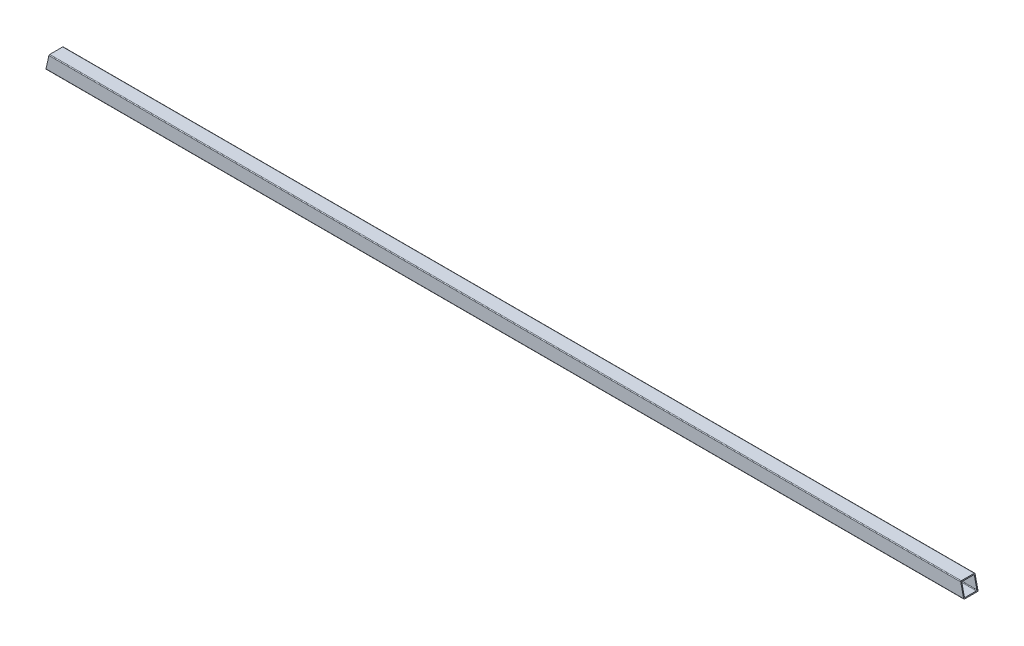
ISO-10303-21;
HEADER;
FILE_DESCRIPTION(('STEP AP214'),'2;1');
FILE_NAME('part.step','',(''),(''),'','','');
FILE_SCHEMA(('AUTOMOTIVE_DESIGN { 1 0 10303 214 1 1 1 1 }'));
ENDSEC;
DATA;
#1=APPLICATION_CONTEXT('core data for automotive mechanical design processes');
#2=APPLICATION_PROTOCOL_DEFINITION('international standard','automotive_design',2000,#1);
#3=PRODUCT_CONTEXT('',#1,'mechanical');
#4=PRODUCT('Part','Part','',(#3));
#5=PRODUCT_RELATED_PRODUCT_CATEGORY('part','',(#4));
#6=PRODUCT_DEFINITION_FORMATION('','',#4);
#7=PRODUCT_DEFINITION_CONTEXT('part definition',#1,'design');
#8=PRODUCT_DEFINITION('design','',#6,#7);
#9=PRODUCT_DEFINITION_SHAPE('','',#8);
#10=(LENGTH_UNIT() NAMED_UNIT(*) SI_UNIT(.MILLI.,.METRE.));
#11=(NAMED_UNIT(*) PLANE_ANGLE_UNIT() SI_UNIT($,.RADIAN.));
#12=(NAMED_UNIT(*) SI_UNIT($,.STERADIAN.) SOLID_ANGLE_UNIT());
#13=UNCERTAINTY_MEASURE_WITH_UNIT(LENGTH_MEASURE(1.E-05),#10,'distance_accuracy_value','');
#14=(GEOMETRIC_REPRESENTATION_CONTEXT(3) GLOBAL_UNCERTAINTY_ASSIGNED_CONTEXT((#13)) GLOBAL_UNIT_ASSIGNED_CONTEXT((#10,
#11,#12)) REPRESENTATION_CONTEXT('',''));
#15=CARTESIAN_POINT('',(0.,0.,0.));
#16=DIRECTION('',(0.,0.,1.));
#17=DIRECTION('',(1.,0.,0.));
#18=AXIS2_PLACEMENT_3D('',#15,#16,#17);
#19=CARTESIAN_POINT('',(812.8,-11.43,-11.43));
#20=DIRECTION('',(-1.,0.,0.));
#21=DIRECTION('',(0.,0.,1.));
#22=AXIS2_PLACEMENT_3D('',#19,#20,#21);
#23=CYLINDRICAL_SURFACE('',#22,1.27);
#24=CARTESIAN_POINT('',(-812.518447778444,-11.43,-11.43));
#25=DIRECTION('',(-0.976296007119935,0.216439613938096,0.));
#26=DIRECTION('',(-0.216439613938096,-0.976296007119935,0.));
#27=AXIS2_PLACEMENT_3D('',#24,#25,#26);
#28=ELLIPSE('',#27,1.30083498317943,1.27);
#29=CARTESIAN_POINT('',(-812.518447778443,-11.4300000000001,-12.7));
#30=VERTEX_POINT('',#29);
#31=CARTESIAN_POINT('',(-812.8,-12.7,-11.43));
#32=VERTEX_POINT('',#31);
#33=EDGE_CURVE('E203',#30,#32,#28,.T.);
#34=ORIENTED_EDGE('',*,*,#33,.F.);
#35=DIRECTION('',(-1.,0.,0.));
#36=VECTOR('',#35,1.);
#37=CARTESIAN_POINT('',(812.8,-11.43,-12.7));
#38=LINE('',#37,#36);
#39=CARTESIAN_POINT('',(812.518447778443,-11.43,-12.7));
#40=VERTEX_POINT('',#39);
#41=EDGE_CURVE('E48',#40,#30,#38,.T.);
#42=ORIENTED_EDGE('',*,*,#41,.F.);
#43=CARTESIAN_POINT('',(812.518447778443,-11.43,-11.43));
#44=DIRECTION('',(-0.976296007119935,-0.216439613938096,0.));
#45=DIRECTION('',(-0.216439613938096,0.976296007119935,0.));
#46=AXIS2_PLACEMENT_3D('',#43,#44,#45);
#47=ELLIPSE('',#46,1.30083498317943,1.27);
#48=CARTESIAN_POINT('',(812.8,-12.7,-11.43));
#49=VERTEX_POINT('',#48);
#50=EDGE_CURVE('E201',#40,#49,#47,.T.);
#51=ORIENTED_EDGE('',*,*,#50,.T.);
#52=DIRECTION('',(-1.,0.,0.));
#53=VECTOR('',#52,1.);
#54=CARTESIAN_POINT('',(812.8,-12.7,-11.43));
#55=LINE('',#54,#53);
#56=EDGE_CURVE('E204',#49,#32,#55,.T.);
#57=ORIENTED_EDGE('',*,*,#56,.T.);
#58=EDGE_LOOP('',(#34,#42,#51,#57));
#59=FACE_BOUND('',#58,.T.);
#60=ADVANCED_FACE('F41',(#59),#23,.T.);
#61=CARTESIAN_POINT('',(812.8,-11.43,-12.7));
#62=DIRECTION('',(0.,0.,1.));
#63=DIRECTION('',(1.,0.,0.));
#64=AXIS2_PLACEMENT_3D('',#61,#62,#63);
#65=PLANE('',#64);
#66=DIRECTION('',(-0.216439613938096,-0.976296007119935,0.));
#67=VECTOR('',#66,1.);
#68=CARTESIAN_POINT('',(-812.8,-12.7,-12.7));
#69=LINE('',#68,#67);
#70=CARTESIAN_POINT('',(-807.450507790426,11.43,-12.7));
#71=VERTEX_POINT('',#70);
#72=EDGE_CURVE('E162',#71,#30,#69,.T.);
#73=ORIENTED_EDGE('',*,*,#72,.F.);
#74=DIRECTION('',(-1.,0.,0.));
#75=VECTOR('',#74,1.);
#76=CARTESIAN_POINT('',(812.8,11.43,-12.7));
#77=LINE('',#76,#75);
#78=CARTESIAN_POINT('',(807.450507790426,11.43,-12.7));
#79=VERTEX_POINT('',#78);
#80=EDGE_CURVE('E187',#79,#71,#77,.T.);
#81=ORIENTED_EDGE('',*,*,#80,.F.);
#82=DIRECTION('',(0.216439613938096,-0.976296007119935,0.));
#83=VECTOR('',#82,1.);
#84=CARTESIAN_POINT('',(812.8,-12.7,-12.7));
#85=LINE('',#84,#83);
#86=EDGE_CURVE('E196',#79,#40,#85,.T.);
#87=ORIENTED_EDGE('',*,*,#86,.T.);
#88=ORIENTED_EDGE('',*,*,#41,.T.);
#89=EDGE_LOOP('',(#73,#81,#87,#88));
#90=FACE_BOUND('',#89,.T.);
#91=ADVANCED_FACE('F194',(#90),#65,.F.);
#92=CARTESIAN_POINT('',(812.8,11.43,-11.43));
#93=DIRECTION('',(-1.,0.,0.));
#94=DIRECTION('',(0.,0.,1.));
#95=AXIS2_PLACEMENT_3D('',#92,#93,#94);
#96=CYLINDRICAL_SURFACE('',#95,1.27);
#97=CARTESIAN_POINT('',(-807.450507790426,11.43,-11.43));
#98=DIRECTION('',(-0.976296007119935,0.216439613938096,0.));
#99=DIRECTION('',(-0.216439613938096,-0.976296007119935,0.));
#100=AXIS2_PLACEMENT_3D('',#97,#98,#99);
#101=ELLIPSE('',#100,1.30083498317942,1.27);
#102=CARTESIAN_POINT('',(-807.168955568869,12.7,-11.43));
#103=VERTEX_POINT('',#102);
#104=EDGE_CURVE('E172',#103,#71,#101,.T.);
#105=ORIENTED_EDGE('',*,*,#104,.F.);
#106=DIRECTION('',(-1.,0.,0.));
#107=VECTOR('',#106,1.);
#108=CARTESIAN_POINT('',(812.8,12.7,-11.43));
#109=LINE('',#108,#107);
#110=CARTESIAN_POINT('',(807.168955568869,12.7,-11.43));
#111=VERTEX_POINT('',#110);
#112=EDGE_CURVE('E179',#111,#103,#109,.T.);
#113=ORIENTED_EDGE('',*,*,#112,.F.);
#114=CARTESIAN_POINT('',(807.450507790426,11.43,-11.43));
#115=DIRECTION('',(-0.976296007119935,-0.216439613938096,0.));
#116=DIRECTION('',(-0.216439613938096,0.976296007119935,0.));
#117=AXIS2_PLACEMENT_3D('',#114,#115,#116);
#118=ELLIPSE('',#117,1.30083498317942,1.27);
#119=EDGE_CURVE('E231',#111,#79,#118,.T.);
#120=ORIENTED_EDGE('',*,*,#119,.T.);
#121=ORIENTED_EDGE('',*,*,#80,.T.);
#122=EDGE_LOOP('',(#105,#113,#120,#121));
#123=FACE_BOUND('',#122,.T.);
#124=ADVANCED_FACE('F298',(#123),#96,.T.);
#125=CARTESIAN_POINT('',(812.8,12.7,-11.43));
#126=DIRECTION('',(0.,-1.,0.));
#127=DIRECTION('',(0.,0.,-1.));
#128=AXIS2_PLACEMENT_3D('',#125,#126,#127);
#129=PLANE('',#128);
#130=DIRECTION('',(0.,0.,1.));
#131=VECTOR('',#130,1.);
#132=CARTESIAN_POINT('',(-807.168955568869,12.7,-12.7));
#133=LINE('',#132,#131);
#134=CARTESIAN_POINT('',(-807.16895556887,12.7,11.43));
#135=VERTEX_POINT('',#134);
#136=EDGE_CURVE('E293',#103,#135,#133,.T.);
#137=ORIENTED_EDGE('',*,*,#136,.T.);
#138=DIRECTION('',(-1.,0.,0.));
#139=VECTOR('',#138,1.);
#140=CARTESIAN_POINT('',(812.8,12.7,11.43));
#141=LINE('',#140,#139);
#142=CARTESIAN_POINT('',(807.168955568869,12.7,11.43));
#143=VERTEX_POINT('',#142);
#144=EDGE_CURVE('E171',#143,#135,#141,.T.);
#145=ORIENTED_EDGE('',*,*,#144,.F.);
#146=DIRECTION('',(0.,0.,1.));
#147=VECTOR('',#146,1.);
#148=CARTESIAN_POINT('',(807.168955568869,12.7,-12.7));
#149=LINE('',#148,#147);
#150=EDGE_CURVE('E210',#111,#143,#149,.T.);
#151=ORIENTED_EDGE('',*,*,#150,.F.);
#152=ORIENTED_EDGE('',*,*,#112,.T.);
#153=EDGE_LOOP('',(#137,#145,#151,#152));
#154=FACE_BOUND('',#153,.T.);
#155=ADVANCED_FACE('F301',(#154),#129,.F.);
#156=CARTESIAN_POINT('',(812.8,11.43,11.43));
#157=DIRECTION('',(-1.,0.,0.));
#158=DIRECTION('',(0.,0.,1.));
#159=AXIS2_PLACEMENT_3D('',#156,#157,#158);
#160=CYLINDRICAL_SURFACE('',#159,1.27);
#161=CARTESIAN_POINT('',(-807.450507790426,11.43,11.43));
#162=DIRECTION('',(-0.976296007119935,0.216439613938096,0.));
#163=DIRECTION('',(-0.216439613938096,-0.976296007119935,0.));
#164=AXIS2_PLACEMENT_3D('',#161,#162,#163);
#165=ELLIPSE('',#164,1.30083498317943,1.27);
#166=CARTESIAN_POINT('',(-807.450507790426,11.43,12.7));
#167=VERTEX_POINT('',#166);
#168=EDGE_CURVE('E154',#167,#135,#165,.T.);
#169=ORIENTED_EDGE('',*,*,#168,.F.);
#170=DIRECTION('',(-1.,0.,0.));
#171=VECTOR('',#170,1.);
#172=CARTESIAN_POINT('',(812.8,11.43,12.7));
#173=LINE('',#172,#171);
#174=CARTESIAN_POINT('',(807.450507790426,11.43,12.7));
#175=VERTEX_POINT('',#174);
#176=EDGE_CURVE('E169',#175,#167,#173,.T.);
#177=ORIENTED_EDGE('',*,*,#176,.F.);
#178=CARTESIAN_POINT('',(807.450507790426,11.43,11.43));
#179=DIRECTION('',(-0.976296007119935,-0.216439613938096,0.));
#180=DIRECTION('',(-0.216439613938096,0.976296007119935,0.));
#181=AXIS2_PLACEMENT_3D('',#178,#179,#180);
#182=ELLIPSE('',#181,1.30083498317943,1.27);
#183=EDGE_CURVE('E229',#175,#143,#182,.T.);
#184=ORIENTED_EDGE('',*,*,#183,.T.);
#185=ORIENTED_EDGE('',*,*,#144,.T.);
#186=EDGE_LOOP('',(#169,#177,#184,#185));
#187=FACE_BOUND('',#186,.T.);
#188=ADVANCED_FACE('F167',(#187),#160,.T.);
#189=CARTESIAN_POINT('',(812.8,-11.43,12.7));
#190=DIRECTION('',(0.,0.,-1.));
#191=DIRECTION('',(-1.,0.,0.));
#192=AXIS2_PLACEMENT_3D('',#189,#190,#191);
#193=PLANE('',#192);
#194=DIRECTION('',(-0.216439613938096,-0.976296007119935,0.));
#195=VECTOR('',#194,1.);
#196=CARTESIAN_POINT('',(-812.8,-12.7,12.7));
#197=LINE('',#196,#195);
#198=CARTESIAN_POINT('',(-812.518447778443,-11.43,12.7));
#199=VERTEX_POINT('',#198);
#200=EDGE_CURVE('E151',#167,#199,#197,.T.);
#201=ORIENTED_EDGE('',*,*,#200,.T.);
#202=DIRECTION('',(-1.,0.,0.));
#203=VECTOR('',#202,1.);
#204=CARTESIAN_POINT('',(812.8,-11.43,12.7));
#205=LINE('',#204,#203);
#206=CARTESIAN_POINT('',(812.518447778443,-11.43,12.7));
#207=VERTEX_POINT('',#206);
#208=EDGE_CURVE('E177',#207,#199,#205,.T.);
#209=ORIENTED_EDGE('',*,*,#208,.F.);
#210=DIRECTION('',(0.216439613938096,-0.976296007119935,0.));
#211=VECTOR('',#210,1.);
#212=CARTESIAN_POINT('',(812.8,-12.7,12.7));
#213=LINE('',#212,#211);
#214=EDGE_CURVE('E176',#175,#207,#213,.T.);
#215=ORIENTED_EDGE('',*,*,#214,.F.);
#216=ORIENTED_EDGE('',*,*,#176,.T.);
#217=EDGE_LOOP('',(#201,#209,#215,#216));
#218=FACE_BOUND('',#217,.T.);
#219=ADVANCED_FACE('F175',(#218),#193,.F.);
#220=CARTESIAN_POINT('',(812.8,-11.43,11.43));
#221=DIRECTION('',(-1.,0.,0.));
#222=DIRECTION('',(0.,0.,1.));
#223=AXIS2_PLACEMENT_3D('',#220,#221,#222);
#224=CYLINDRICAL_SURFACE('',#223,1.27);
#225=CARTESIAN_POINT('',(-812.518447778444,-11.43,11.43));
#226=DIRECTION('',(-0.976296007119935,0.216439613938096,0.));
#227=DIRECTION('',(-0.216439613938096,-0.976296007119935,0.));
#228=AXIS2_PLACEMENT_3D('',#225,#226,#227);
#229=ELLIPSE('',#228,1.30083498317943,1.27);
#230=CARTESIAN_POINT('',(-812.8,-12.7,11.43));
#231=VERTEX_POINT('',#230);
#232=EDGE_CURVE('E157',#231,#199,#229,.T.);
#233=ORIENTED_EDGE('',*,*,#232,.F.);
#234=DIRECTION('',(-1.,0.,0.));
#235=VECTOR('',#234,1.);
#236=CARTESIAN_POINT('',(812.8,-12.7,11.43));
#237=LINE('',#236,#235);
#238=CARTESIAN_POINT('',(812.8,-12.7,11.43));
#239=VERTEX_POINT('',#238);
#240=EDGE_CURVE('E181',#239,#231,#237,.T.);
#241=ORIENTED_EDGE('',*,*,#240,.F.);
#242=CARTESIAN_POINT('',(812.518447778443,-11.43,11.43));
#243=DIRECTION('',(-0.976296007119935,-0.216439613938096,0.));
#244=DIRECTION('',(-0.216439613938096,0.976296007119935,0.));
#245=AXIS2_PLACEMENT_3D('',#242,#243,#244);
#246=ELLIPSE('',#245,1.30083498317943,1.27);
#247=EDGE_CURVE('E226',#239,#207,#246,.T.);
#248=ORIENTED_EDGE('',*,*,#247,.T.);
#249=ORIENTED_EDGE('',*,*,#208,.T.);
#250=EDGE_LOOP('',(#233,#241,#248,#249));
#251=FACE_BOUND('',#250,.T.);
#252=ADVANCED_FACE('F269',(#251),#224,.T.);
#253=CARTESIAN_POINT('',(812.8,9.9441,-9.9441));
#254=DIRECTION('',(-1.,0.,0.));
#255=DIRECTION('',(0.,0.,1.));
#256=AXIS2_PLACEMENT_3D('',#253,#254,#255);
#257=CYLINDRICAL_SURFACE('',#256,1.1049);
#258=DIRECTION('',(-1.,0.,0.));
#259=VECTOR('',#258,1.);
#260=CARTESIAN_POINT('',(812.8,11.049,-9.94409999999999));
#261=LINE('',#260,#259);
#262=CARTESIAN_POINT('',(807.534973456893,11.049,-9.94409999999999));
#263=VERTEX_POINT('',#262);
#264=CARTESIAN_POINT('',(-807.534973456893,11.049,-9.94409999999999));
#265=VERTEX_POINT('',#264);
#266=EDGE_CURVE('E258',#263,#265,#261,.T.);
#267=ORIENTED_EDGE('',*,*,#266,.T.);
#268=CARTESIAN_POINT('',(-807.779923889647,9.9441,-9.9441));
#269=DIRECTION('',(-0.976296007119935,0.216439613938096,0.));
#270=DIRECTION('',(-0.216439613938096,-0.976296007119935,0.));
#271=AXIS2_PLACEMENT_3D('',#268,#269,#270);
#272=ELLIPSE('',#271,1.1317264353661,1.1049);
#273=CARTESIAN_POINT('',(-807.779923889647,9.94410000000001,-11.049));
#274=VERTEX_POINT('',#273);
#275=EDGE_CURVE('E270',#265,#274,#272,.T.);
#276=ORIENTED_EDGE('',*,*,#275,.T.);
#277=DIRECTION('',(-1.,0.,0.));
#278=VECTOR('',#277,1.);
#279=CARTESIAN_POINT('',(812.8,9.9441,-11.049));
#280=LINE('',#279,#278);
#281=CARTESIAN_POINT('',(807.779923889647,9.9441,-11.049));
#282=VERTEX_POINT('',#281);
#283=EDGE_CURVE('E237',#282,#274,#280,.T.);
#284=ORIENTED_EDGE('',*,*,#283,.F.);
#285=CARTESIAN_POINT('',(807.779923889647,9.9441,-9.9441));
#286=DIRECTION('',(-0.976296007119935,-0.216439613938096,0.));
#287=DIRECTION('',(-0.216439613938096,0.976296007119935,0.));
#288=AXIS2_PLACEMENT_3D('',#285,#286,#287);
#289=ELLIPSE('',#288,1.1317264353661,1.1049);
#290=EDGE_CURVE('E62',#263,#282,#289,.T.);
#291=ORIENTED_EDGE('',*,*,#290,.F.);
#292=EDGE_LOOP('',(#267,#276,#284,#291));
#293=FACE_BOUND('',#292,.T.);
#294=ADVANCED_FACE('F330',(#293),#257,.F.);
#295=CARTESIAN_POINT('',(812.8,11.049,-9.94409999999999));
#296=DIRECTION('',(0.,-1.,0.));
#297=DIRECTION('',(0.,0.,-1.));
#298=AXIS2_PLACEMENT_3D('',#295,#296,#297);
#299=PLANE('',#298);
#300=DIRECTION('',(-1.,0.,0.));
#301=VECTOR('',#300,1.);
#302=CARTESIAN_POINT('',(812.8,11.049,9.94409999999999));
#303=LINE('',#302,#301);
#304=CARTESIAN_POINT('',(807.534973456893,11.049,9.94409999999999));
#305=VERTEX_POINT('',#304);
#306=CARTESIAN_POINT('',(-807.534973456893,11.049,9.94409999999999));
#307=VERTEX_POINT('',#306);
#308=EDGE_CURVE('E255',#305,#307,#303,.T.);
#309=ORIENTED_EDGE('',*,*,#308,.T.);
#310=DIRECTION('',(0.,0.,-1.));
#311=VECTOR('',#310,1.);
#312=CARTESIAN_POINT('',(-807.534973456893,11.049,-9.94409999999996));
#313=LINE('',#312,#311);
#314=EDGE_CURVE('E273',#307,#265,#313,.T.);
#315=ORIENTED_EDGE('',*,*,#314,.T.);
#316=ORIENTED_EDGE('',*,*,#266,.F.);
#317=DIRECTION('',(0.,0.,-1.));
#318=VECTOR('',#317,1.);
#319=CARTESIAN_POINT('',(807.534973456893,11.049,-9.94409999999999));
#320=LINE('',#319,#318);
#321=EDGE_CURVE('E223',#305,#263,#320,.T.);
#322=ORIENTED_EDGE('',*,*,#321,.F.);
#323=EDGE_LOOP('',(#309,#315,#316,#322));
#324=FACE_BOUND('',#323,.T.);
#325=ADVANCED_FACE('F334',(#324),#299,.T.);
#326=CARTESIAN_POINT('',(812.8,9.94409999999999,9.94409999999999));
#327=DIRECTION('',(-1.,0.,0.));
#328=DIRECTION('',(0.,0.,1.));
#329=AXIS2_PLACEMENT_3D('',#326,#327,#328);
#330=CYLINDRICAL_SURFACE('',#329,1.10490000000001);
#331=DIRECTION('',(-1.,0.,0.));
#332=VECTOR('',#331,1.);
#333=CARTESIAN_POINT('',(812.8,9.94409999999999,11.049));
#334=LINE('',#333,#332);
#335=CARTESIAN_POINT('',(807.779923889647,9.94409999999999,11.049));
#336=VERTEX_POINT('',#335);
#337=CARTESIAN_POINT('',(-807.779923889647,9.94410000000001,11.049));
#338=VERTEX_POINT('',#337);
#339=EDGE_CURVE('E252',#336,#338,#334,.T.);
#340=ORIENTED_EDGE('',*,*,#339,.T.);
#341=CARTESIAN_POINT('',(-807.779923889647,9.94409999999999,9.94409999999999));
#342=DIRECTION('',(-0.976296007119935,0.216439613938096,0.));
#343=DIRECTION('',(-0.216439613938096,-0.976296007119935,0.));
#344=AXIS2_PLACEMENT_3D('',#341,#342,#343);
#345=ELLIPSE('',#344,1.13172643536611,1.10490000000001);
#346=EDGE_CURVE('E278',#338,#307,#345,.T.);
#347=ORIENTED_EDGE('',*,*,#346,.T.);
#348=ORIENTED_EDGE('',*,*,#308,.F.);
#349=CARTESIAN_POINT('',(807.779923889647,9.94409999999999,9.94409999999999));
#350=DIRECTION('',(-0.976296007119935,-0.216439613938096,0.));
#351=DIRECTION('',(-0.216439613938096,0.976296007119935,0.));
#352=AXIS2_PLACEMENT_3D('',#349,#350,#351);
#353=ELLIPSE('',#352,1.13172643536611,1.10490000000001);
#354=EDGE_CURVE('E221',#336,#305,#353,.T.);
#355=ORIENTED_EDGE('',*,*,#354,.F.);
#356=EDGE_LOOP('',(#340,#347,#348,#355));
#357=FACE_BOUND('',#356,.T.);
#358=ADVANCED_FACE('F338',(#357),#330,.F.);
#359=CARTESIAN_POINT('',(812.8,9.94409999999999,11.049));
#360=DIRECTION('',(0.,0.,-1.));
#361=DIRECTION('',(0.,1.,0.));
#362=AXIS2_PLACEMENT_3D('',#359,#360,#361);
#363=PLANE('',#362);
#364=DIRECTION('',(-1.,0.,0.));
#365=VECTOR('',#364,1.);
#366=CARTESIAN_POINT('',(812.8,-9.9441,11.049));
#367=LINE('',#366,#365);
#368=CARTESIAN_POINT('',(812.189031679222,-9.9441,11.049));
#369=VERTEX_POINT('',#368);
#370=CARTESIAN_POINT('',(-812.189031679222,-9.9441,11.049));
#371=VERTEX_POINT('',#370);
#372=EDGE_CURVE('E249',#369,#371,#367,.T.);
#373=ORIENTED_EDGE('',*,*,#372,.T.);
#374=DIRECTION('',(0.216439613938096,0.976296007119935,0.));
#375=VECTOR('',#374,1.);
#376=CARTESIAN_POINT('',(-731.862064213053,352.387435223049,11.0490000000001));
#377=LINE('',#376,#375);
#378=EDGE_CURVE('E281',#371,#338,#377,.T.);
#379=ORIENTED_EDGE('',*,*,#378,.T.);
#380=ORIENTED_EDGE('',*,*,#339,.F.);
#381=DIRECTION('',(-0.216439613938096,0.976296007119935,0.));
#382=VECTOR('',#381,1.);
#383=CARTESIAN_POINT('',(808.015094909659,8.88331208021836,11.049));
#384=LINE('',#383,#382);
#385=EDGE_CURVE('E219',#369,#336,#384,.T.);
#386=ORIENTED_EDGE('',*,*,#385,.F.);
#387=EDGE_LOOP('',(#373,#379,#380,#386));
#388=FACE_BOUND('',#387,.T.);
#389=ADVANCED_FACE('F342',(#388),#363,.T.);
#390=CARTESIAN_POINT('',(812.8,-9.9441,9.9441));
#391=DIRECTION('',(-1.,0.,0.));
#392=DIRECTION('',(0.,0.,1.));
#393=AXIS2_PLACEMENT_3D('',#390,#391,#392);
#394=CYLINDRICAL_SURFACE('',#393,1.1049);
#395=DIRECTION('',(-1.,0.,0.));
#396=VECTOR('',#395,1.);
#397=CARTESIAN_POINT('',(812.8,-11.049,9.94409999999999));
#398=LINE('',#397,#396);
#399=CARTESIAN_POINT('',(812.433982111976,-11.049,9.94409999999999));
#400=VERTEX_POINT('',#399);
#401=CARTESIAN_POINT('',(-812.433982111977,-11.049,9.94409999999999));
#402=VERTEX_POINT('',#401);
#403=EDGE_CURVE('E246',#400,#402,#398,.T.);
#404=ORIENTED_EDGE('',*,*,#403,.T.);
#405=CARTESIAN_POINT('',(-812.189031679222,-9.9441,9.9441));
#406=DIRECTION('',(-0.976296007119935,0.216439613938096,0.));
#407=DIRECTION('',(-0.216439613938096,-0.976296007119935,0.));
#408=AXIS2_PLACEMENT_3D('',#405,#406,#407);
#409=ELLIPSE('',#408,1.1317264353661,1.1049);
#410=EDGE_CURVE('E284',#402,#371,#409,.T.);
#411=ORIENTED_EDGE('',*,*,#410,.T.);
#412=ORIENTED_EDGE('',*,*,#372,.F.);
#413=CARTESIAN_POINT('',(812.189031679222,-9.9441,9.9441));
#414=DIRECTION('',(-0.976296007119935,-0.216439613938096,0.));
#415=DIRECTION('',(-0.216439613938096,0.976296007119935,0.));
#416=AXIS2_PLACEMENT_3D('',#413,#414,#415);
#417=ELLIPSE('',#416,1.1317264353661,1.1049);
#418=EDGE_CURVE('E217',#400,#369,#417,.T.);
#419=ORIENTED_EDGE('',*,*,#418,.F.);
#420=EDGE_LOOP('',(#404,#411,#412,#419));
#421=FACE_BOUND('',#420,.T.);
#422=ADVANCED_FACE('F346',(#421),#394,.F.);
#423=CARTESIAN_POINT('',(812.8,-11.049,-9.94409999999999));
#424=DIRECTION('',(0.,1.,0.));
#425=DIRECTION('',(0.,0.,1.));
#426=AXIS2_PLACEMENT_3D('',#423,#424,#425);
#427=PLANE('',#426);
#428=DIRECTION('',(-1.,0.,0.));
#429=VECTOR('',#428,1.);
#430=CARTESIAN_POINT('',(812.8,-11.049,-9.94409999999999));
#431=LINE('',#430,#429);
#432=CARTESIAN_POINT('',(812.433982111976,-11.049,-9.94409999999999));
#433=VERTEX_POINT('',#432);
#434=CARTESIAN_POINT('',(-812.433982111977,-11.049,-9.94409999999999));
#435=VERTEX_POINT('',#434);
#436=EDGE_CURVE('E243',#433,#435,#431,.T.);
#437=ORIENTED_EDGE('',*,*,#436,.T.);
#438=DIRECTION('',(0.,0.,1.));
#439=VECTOR('',#438,1.);
#440=CARTESIAN_POINT('',(-812.433982111977,-11.049,-9.94410000000003));
#441=LINE('',#440,#439);
#442=EDGE_CURVE('E287',#435,#402,#441,.T.);
#443=ORIENTED_EDGE('',*,*,#442,.T.);
#444=ORIENTED_EDGE('',*,*,#403,.F.);
#445=DIRECTION('',(0.,0.,1.));
#446=VECTOR('',#445,1.);
#447=CARTESIAN_POINT('',(812.433982111976,-11.049,-9.94409999999999));
#448=LINE('',#447,#446);
#449=EDGE_CURVE('E215',#433,#400,#448,.T.);
#450=ORIENTED_EDGE('',*,*,#449,.F.);
#451=EDGE_LOOP('',(#437,#443,#444,#450));
#452=FACE_BOUND('',#451,.T.);
#453=ADVANCED_FACE('F350',(#452),#427,.T.);
#454=CARTESIAN_POINT('',(812.8,-9.9441,-9.9441));
#455=DIRECTION('',(-1.,0.,0.));
#456=DIRECTION('',(0.,0.,1.));
#457=AXIS2_PLACEMENT_3D('',#454,#455,#456);
#458=CYLINDRICAL_SURFACE('',#457,1.1049);
#459=DIRECTION('',(-1.,0.,0.));
#460=VECTOR('',#459,1.);
#461=CARTESIAN_POINT('',(812.8,-9.9441,-11.049));
#462=LINE('',#461,#460);
#463=CARTESIAN_POINT('',(812.189031679222,-9.9441,-11.049));
#464=VERTEX_POINT('',#463);
#465=CARTESIAN_POINT('',(-812.189031679222,-9.9441,-11.049));
#466=VERTEX_POINT('',#465);
#467=EDGE_CURVE('E240',#464,#466,#462,.T.);
#468=ORIENTED_EDGE('',*,*,#467,.T.);
#469=CARTESIAN_POINT('',(-812.189031679222,-9.9441,-9.9441));
#470=DIRECTION('',(-0.976296007119935,0.216439613938096,0.));
#471=DIRECTION('',(-0.216439613938096,-0.976296007119935,0.));
#472=AXIS2_PLACEMENT_3D('',#469,#470,#471);
#473=ELLIPSE('',#472,1.1317264353661,1.1049);
#474=EDGE_CURVE('E55',#466,#435,#473,.T.);
#475=ORIENTED_EDGE('',*,*,#474,.T.);
#476=ORIENTED_EDGE('',*,*,#436,.F.);
#477=CARTESIAN_POINT('',(812.189031679222,-9.9441,-9.9441));
#478=DIRECTION('',(-0.976296007119935,-0.216439613938096,0.));
#479=DIRECTION('',(-0.216439613938096,0.976296007119935,0.));
#480=AXIS2_PLACEMENT_3D('',#477,#478,#479);
#481=ELLIPSE('',#480,1.1317264353661,1.1049);
#482=EDGE_CURVE('E213',#464,#433,#481,.T.);
#483=ORIENTED_EDGE('',*,*,#482,.F.);
#484=EDGE_LOOP('',(#468,#475,#476,#483));
#485=FACE_BOUND('',#484,.T.);
#486=ADVANCED_FACE('F354',(#485),#458,.F.);
#487=CARTESIAN_POINT('',(812.8,9.9441,-11.049));
#488=DIRECTION('',(0.,0.,1.));
#489=DIRECTION('',(1.,0.,0.));
#490=AXIS2_PLACEMENT_3D('',#487,#488,#489);
#491=PLANE('',#490);
#492=ORIENTED_EDGE('',*,*,#283,.T.);
#493=DIRECTION('',(-0.216439613938096,-0.976296007119935,0.));
#494=VECTOR('',#493,1.);
#495=CARTESIAN_POINT('',(-731.862064213053,352.387435223049,-11.049));
#496=LINE('',#495,#494);
#497=EDGE_CURVE('E291',#274,#466,#496,.T.);
#498=ORIENTED_EDGE('',*,*,#497,.T.);
#499=ORIENTED_EDGE('',*,*,#467,.F.);
#500=DIRECTION('',(0.216439613938096,-0.976296007119935,0.));
#501=VECTOR('',#500,1.);
#502=CARTESIAN_POINT('',(808.015094909659,8.88331208021836,-11.049));
#503=LINE('',#502,#501);
#504=EDGE_CURVE('E11',#282,#464,#503,.T.);
#505=ORIENTED_EDGE('',*,*,#504,.F.);
#506=EDGE_LOOP('',(#492,#498,#499,#505));
#507=FACE_BOUND('',#506,.T.);
#508=ADVANCED_FACE('F312',(#507),#491,.T.);
#509=CARTESIAN_POINT('',(812.8,-12.7,-11.43));
#510=DIRECTION('',(0.,1.,0.));
#511=DIRECTION('',(0.,0.,1.));
#512=AXIS2_PLACEMENT_3D('',#509,#510,#511);
#513=PLANE('',#512);
#514=ORIENTED_EDGE('',*,*,#240,.T.);
#515=DIRECTION('',(0.,0.,-1.));
#516=VECTOR('',#515,1.);
#517=CARTESIAN_POINT('',(-812.8,-12.7,-11.43));
#518=LINE('',#517,#516);
#519=EDGE_CURVE('E235',#231,#32,#518,.T.);
#520=ORIENTED_EDGE('',*,*,#519,.T.);
#521=ORIENTED_EDGE('',*,*,#56,.F.);
#522=DIRECTION('',(0.,0.,-1.));
#523=VECTOR('',#522,1.);
#524=CARTESIAN_POINT('',(812.8,-12.7,-11.43));
#525=LINE('',#524,#523);
#526=EDGE_CURVE('E261',#239,#49,#525,.T.);
#527=ORIENTED_EDGE('',*,*,#526,.F.);
#528=EDGE_LOOP('',(#514,#520,#521,#527));
#529=FACE_BOUND('',#528,.T.);
#530=ADVANCED_FACE('F267',(#529),#513,.F.);
#531=CARTESIAN_POINT('',(812.8,-12.7,-12.7));
#532=DIRECTION('',(-0.976296007119935,-0.216439613938096,0.));
#533=DIRECTION('',(0.216439613938096,-0.976296007119935,0.));
#534=AXIS2_PLACEMENT_3D('',#531,#532,#533);
#535=PLANE('',#534);
#536=ORIENTED_EDGE('',*,*,#290,.T.);
#537=ORIENTED_EDGE('',*,*,#504,.T.);
#538=ORIENTED_EDGE('',*,*,#482,.T.);
#539=ORIENTED_EDGE('',*,*,#449,.T.);
#540=ORIENTED_EDGE('',*,*,#418,.T.);
#541=ORIENTED_EDGE('',*,*,#385,.T.);
#542=ORIENTED_EDGE('',*,*,#354,.T.);
#543=ORIENTED_EDGE('',*,*,#321,.T.);
#544=EDGE_LOOP('',(#536,#537,#538,#539,#540,#541,#542,#543));
#545=FACE_BOUND('',#544,.T.);
#546=ORIENTED_EDGE('',*,*,#86,.F.);
#547=ORIENTED_EDGE('',*,*,#119,.F.);
#548=ORIENTED_EDGE('',*,*,#150,.T.);
#549=ORIENTED_EDGE('',*,*,#183,.F.);
#550=ORIENTED_EDGE('',*,*,#214,.T.);
#551=ORIENTED_EDGE('',*,*,#247,.F.);
#552=ORIENTED_EDGE('',*,*,#526,.T.);
#553=ORIENTED_EDGE('',*,*,#50,.F.);
#554=EDGE_LOOP('',(#546,#547,#548,#549,#550,#551,#552,#553));
#555=FACE_BOUND('',#554,.T.);
#556=ADVANCED_FACE('F303',(#545,#555),#535,.F.);
#557=CARTESIAN_POINT('',(-812.8,-12.7,-12.7));
#558=DIRECTION('',(-0.976296007119935,0.216439613938096,0.));
#559=DIRECTION('',(-0.216439613938096,-0.976296007119935,0.));
#560=AXIS2_PLACEMENT_3D('',#557,#558,#559);
#561=PLANE('',#560);
#562=ORIENTED_EDGE('',*,*,#314,.F.);
#563=ORIENTED_EDGE('',*,*,#346,.F.);
#564=ORIENTED_EDGE('',*,*,#378,.F.);
#565=ORIENTED_EDGE('',*,*,#410,.F.);
#566=ORIENTED_EDGE('',*,*,#442,.F.);
#567=ORIENTED_EDGE('',*,*,#474,.F.);
#568=ORIENTED_EDGE('',*,*,#497,.F.);
#569=ORIENTED_EDGE('',*,*,#275,.F.);
#570=EDGE_LOOP('',(#562,#563,#564,#565,#566,#567,#568,#569));
#571=FACE_BOUND('',#570,.T.);
#572=ORIENTED_EDGE('',*,*,#33,.T.);
#573=ORIENTED_EDGE('',*,*,#519,.F.);
#574=ORIENTED_EDGE('',*,*,#232,.T.);
#575=ORIENTED_EDGE('',*,*,#200,.F.);
#576=ORIENTED_EDGE('',*,*,#168,.T.);
#577=ORIENTED_EDGE('',*,*,#136,.F.);
#578=ORIENTED_EDGE('',*,*,#104,.T.);
#579=ORIENTED_EDGE('',*,*,#72,.T.);
#580=EDGE_LOOP('',(#572,#573,#574,#575,#576,#577,#578,#579));
#581=FACE_BOUND('',#580,.T.);
#582=ADVANCED_FACE('F153',(#571,#581),#561,.T.);
#583=CLOSED_SHELL('',(#60,#91,#124,#155,#188,#219,#252,#294,#325,#358,#389,#422,#453,#486,#508,
#530,#556,#582));
#584=MANIFOLD_SOLID_BREP('B2',#583);
#585=ADVANCED_BREP_SHAPE_REPRESENTATION('',(#18,#584),#14);
#586=SHAPE_DEFINITION_REPRESENTATION(#9,#585);
ENDSEC;
END-ISO-10303-21;
